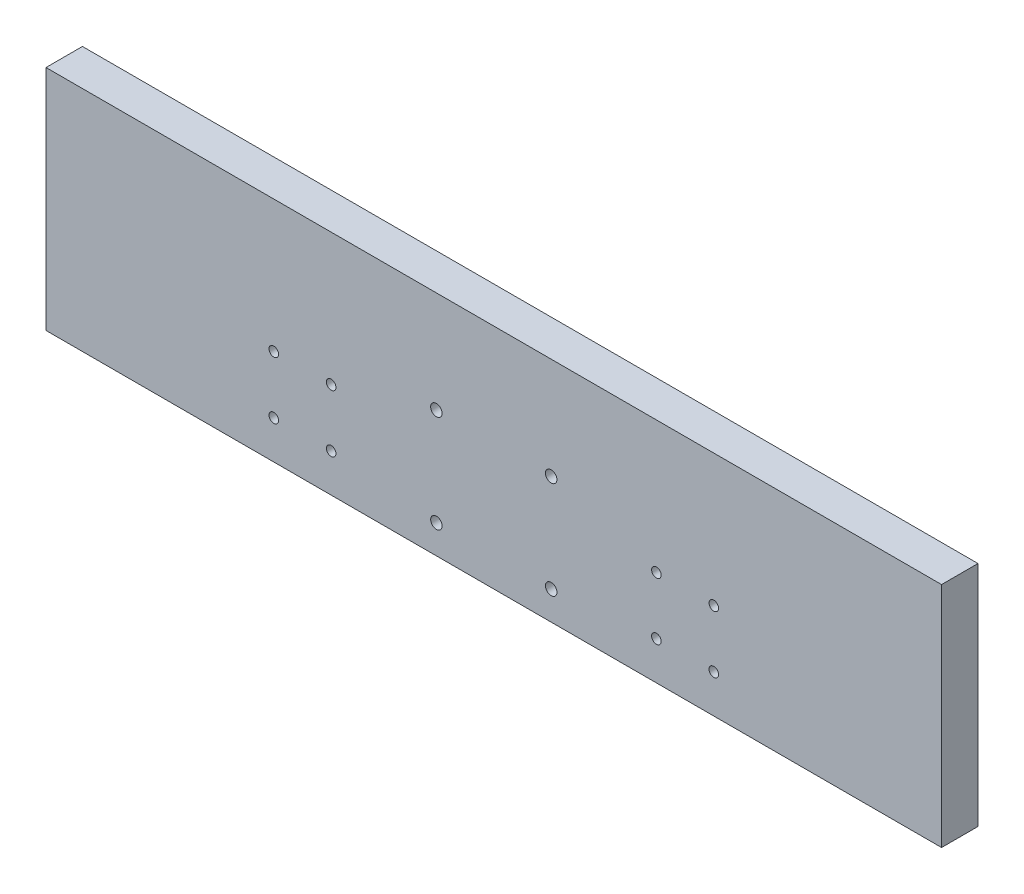
ISO-10303-21;
HEADER;
FILE_DESCRIPTION(('STEP AP214'),'2;1');
FILE_NAME('part.step','',(''),(''),'','','');
FILE_SCHEMA(('AUTOMOTIVE_DESIGN { 1 0 10303 214 1 1 1 1 }'));
ENDSEC;
DATA;
#1=APPLICATION_CONTEXT('core data for automotive mechanical design processes');
#2=APPLICATION_PROTOCOL_DEFINITION('international standard','automotive_design',2000,#1);
#3=PRODUCT_CONTEXT('',#1,'mechanical');
#4=PRODUCT('Part','Part','',(#3));
#5=PRODUCT_RELATED_PRODUCT_CATEGORY('part','',(#4));
#6=PRODUCT_DEFINITION_FORMATION('','',#4);
#7=PRODUCT_DEFINITION_CONTEXT('part definition',#1,'design');
#8=PRODUCT_DEFINITION('design','',#6,#7);
#9=PRODUCT_DEFINITION_SHAPE('','',#8);
#10=(LENGTH_UNIT() NAMED_UNIT(*) SI_UNIT(.MILLI.,.METRE.));
#11=(NAMED_UNIT(*) PLANE_ANGLE_UNIT() SI_UNIT($,.RADIAN.));
#12=(NAMED_UNIT(*) SI_UNIT($,.STERADIAN.) SOLID_ANGLE_UNIT());
#13=UNCERTAINTY_MEASURE_WITH_UNIT(LENGTH_MEASURE(1.E-05),#10,'distance_accuracy_value','');
#14=(GEOMETRIC_REPRESENTATION_CONTEXT(3) GLOBAL_UNCERTAINTY_ASSIGNED_CONTEXT((#13)) GLOBAL_UNIT_ASSIGNED_CONTEXT((#10,
#11,#12)) REPRESENTATION_CONTEXT('',''));
#15=CARTESIAN_POINT('',(0.,0.,0.));
#16=DIRECTION('',(0.,0.,1.));
#17=DIRECTION('',(1.,0.,0.));
#18=AXIS2_PLACEMENT_3D('',#15,#16,#17);
#19=CARTESIAN_POINT('',(234.05,0.,19.05));
#20=DIRECTION('',(-1.,0.,0.));
#21=DIRECTION('',(0.,0.,1.));
#22=AXIS2_PLACEMENT_3D('',#19,#20,#21);
#23=PLANE('',#22);
#24=DIRECTION('',(0.,1.,0.));
#25=VECTOR('',#24,1.);
#26=CARTESIAN_POINT('',(234.05,0.,0.));
#27=LINE('',#26,#25);
#28=CARTESIAN_POINT('',(234.05,0.,0.));
#29=VERTEX_POINT('',#28);
#30=CARTESIAN_POINT('',(234.05,119.05,0.));
#31=VERTEX_POINT('',#30);
#32=EDGE_CURVE('E96',#29,#31,#27,.T.);
#33=ORIENTED_EDGE('',*,*,#32,.T.);
#34=DIRECTION('',(0.,0.,-1.));
#35=VECTOR('',#34,1.);
#36=CARTESIAN_POINT('',(234.05,119.05,19.05));
#37=LINE('',#36,#35);
#38=CARTESIAN_POINT('',(234.05,119.05,19.05));
#39=VERTEX_POINT('',#38);
#40=EDGE_CURVE('E11',#39,#31,#37,.T.);
#41=ORIENTED_EDGE('',*,*,#40,.F.);
#42=DIRECTION('',(0.,1.,0.));
#43=VECTOR('',#42,1.);
#44=CARTESIAN_POINT('',(234.05,0.,19.05));
#45=LINE('',#44,#43);
#46=CARTESIAN_POINT('',(234.05,0.,19.05));
#47=VERTEX_POINT('',#46);
#48=EDGE_CURVE('E84',#47,#39,#45,.T.);
#49=ORIENTED_EDGE('',*,*,#48,.F.);
#50=DIRECTION('',(0.,0.,-1.));
#51=VECTOR('',#50,1.);
#52=CARTESIAN_POINT('',(234.05,0.,19.05));
#53=LINE('',#52,#51);
#54=EDGE_CURVE('E92',#47,#29,#53,.T.);
#55=ORIENTED_EDGE('',*,*,#54,.T.);
#56=EDGE_LOOP('',(#33,#41,#49,#55));
#57=FACE_BOUND('',#56,.T.);
#58=ADVANCED_FACE('F33',(#57),#23,.F.);
#59=CARTESIAN_POINT('',(234.05,119.05,19.05));
#60=DIRECTION('',(0.,-1.,0.));
#61=DIRECTION('',(0.,0.,-1.));
#62=AXIS2_PLACEMENT_3D('',#59,#60,#61);
#63=PLANE('',#62);
#64=DIRECTION('',(-1.,0.,0.));
#65=VECTOR('',#64,1.);
#66=CARTESIAN_POINT('',(234.05,119.05,0.));
#67=LINE('',#66,#65);
#68=CARTESIAN_POINT('',(-234.05,119.05,0.));
#69=VERTEX_POINT('',#68);
#70=EDGE_CURVE('E88',#31,#69,#67,.T.);
#71=ORIENTED_EDGE('',*,*,#70,.T.);
#72=DIRECTION('',(0.,0.,-1.));
#73=VECTOR('',#72,1.);
#74=CARTESIAN_POINT('',(-234.05,119.05,19.05));
#75=LINE('',#74,#73);
#76=CARTESIAN_POINT('',(-234.05,119.05,19.05));
#77=VERTEX_POINT('',#76);
#78=EDGE_CURVE('E41',#77,#69,#75,.T.);
#79=ORIENTED_EDGE('',*,*,#78,.F.);
#80=DIRECTION('',(-1.,0.,0.));
#81=VECTOR('',#80,1.);
#82=CARTESIAN_POINT('',(234.05,119.05,19.05));
#83=LINE('',#82,#81);
#84=EDGE_CURVE('E79',#39,#77,#83,.T.);
#85=ORIENTED_EDGE('',*,*,#84,.F.);
#86=ORIENTED_EDGE('',*,*,#40,.T.);
#87=EDGE_LOOP('',(#71,#79,#85,#86));
#88=FACE_BOUND('',#87,.T.);
#89=ADVANCED_FACE('F87',(#88),#63,.F.);
#90=CARTESIAN_POINT('',(-234.05,0.,19.05));
#91=DIRECTION('',(1.,0.,0.));
#92=DIRECTION('',(0.,0.,-1.));
#93=AXIS2_PLACEMENT_3D('',#90,#91,#92);
#94=PLANE('',#93);
#95=DIRECTION('',(0.,-1.,0.));
#96=VECTOR('',#95,1.);
#97=CARTESIAN_POINT('',(-234.05,0.,0.));
#98=LINE('',#97,#96);
#99=CARTESIAN_POINT('',(-234.05,0.,0.));
#100=VERTEX_POINT('',#99);
#101=EDGE_CURVE('E66',#69,#100,#98,.T.);
#102=ORIENTED_EDGE('',*,*,#101,.T.);
#103=DIRECTION('',(0.,0.,-1.));
#104=VECTOR('',#103,1.);
#105=CARTESIAN_POINT('',(-234.05,0.,19.05));
#106=LINE('',#105,#104);
#107=CARTESIAN_POINT('',(-234.05,0.,19.05));
#108=VERTEX_POINT('',#107);
#109=EDGE_CURVE('E89',#108,#100,#106,.T.);
#110=ORIENTED_EDGE('',*,*,#109,.F.);
#111=DIRECTION('',(0.,-1.,0.));
#112=VECTOR('',#111,1.);
#113=CARTESIAN_POINT('',(-234.05,0.,19.05));
#114=LINE('',#113,#112);
#115=EDGE_CURVE('E82',#77,#108,#114,.T.);
#116=ORIENTED_EDGE('',*,*,#115,.F.);
#117=ORIENTED_EDGE('',*,*,#78,.T.);
#118=EDGE_LOOP('',(#102,#110,#116,#117));
#119=FACE_BOUND('',#118,.T.);
#120=ADVANCED_FACE('F90',(#119),#94,.F.);
#121=CARTESIAN_POINT('',(234.05,0.,19.05));
#122=DIRECTION('',(0.,1.,0.));
#123=DIRECTION('',(0.,0.,1.));
#124=AXIS2_PLACEMENT_3D('',#121,#122,#123);
#125=PLANE('',#124);
#126=DIRECTION('',(1.,0.,0.));
#127=VECTOR('',#126,1.);
#128=CARTESIAN_POINT('',(234.05,0.,0.));
#129=LINE('',#128,#127);
#130=EDGE_CURVE('E72',#100,#29,#129,.T.);
#131=ORIENTED_EDGE('',*,*,#130,.T.);
#132=ORIENTED_EDGE('',*,*,#54,.F.);
#133=DIRECTION('',(1.,0.,0.));
#134=VECTOR('',#133,1.);
#135=CARTESIAN_POINT('',(234.05,0.,19.05));
#136=LINE('',#135,#134);
#137=EDGE_CURVE('E49',#108,#47,#136,.T.);
#138=ORIENTED_EDGE('',*,*,#137,.F.);
#139=ORIENTED_EDGE('',*,*,#109,.T.);
#140=EDGE_LOOP('',(#131,#132,#138,#139));
#141=FACE_BOUND('',#140,.T.);
#142=ADVANCED_FACE('F104',(#141),#125,.F.);
#143=CARTESIAN_POINT('',(0.,0.,19.05));
#144=DIRECTION('',(0.,0.,1.));
#145=DIRECTION('',(1.,0.,0.));
#146=AXIS2_PLACEMENT_3D('',#143,#144,#145);
#147=PLANE('',#146);
#148=CARTESIAN_POINT('',(-30.,15.,19.05));
#149=DIRECTION('',(0.,0.,1.));
#150=DIRECTION('',(1.,0.,0.));
#151=AXIS2_PLACEMENT_3D('',#148,#149,#150);
#152=CIRCLE('',#151,2.99999999999999);
#153=CARTESIAN_POINT('',(-27.,15.,19.05));
#154=VERTEX_POINT('',#153);
#155=EDGE_CURVE('E175',#154,#154,#152,.T.);
#156=ORIENTED_EDGE('',*,*,#155,.F.);
#157=EDGE_LOOP('',(#156));
#158=FACE_BOUND('',#157,.T.);
#159=CARTESIAN_POINT('',(-30.,66.,19.05));
#160=DIRECTION('',(0.,0.,1.));
#161=DIRECTION('',(1.,0.,0.));
#162=AXIS2_PLACEMENT_3D('',#159,#160,#161);
#163=CIRCLE('',#162,2.99999999999999);
#164=CARTESIAN_POINT('',(-27.,66.,19.05));
#165=VERTEX_POINT('',#164);
#166=EDGE_CURVE('E169',#165,#165,#163,.T.);
#167=ORIENTED_EDGE('',*,*,#166,.F.);
#168=EDGE_LOOP('',(#167));
#169=FACE_BOUND('',#168,.T.);
#170=CARTESIAN_POINT('',(30.,15.,19.05));
#171=DIRECTION('',(0.,0.,1.));
#172=DIRECTION('',(1.,0.,0.));
#173=AXIS2_PLACEMENT_3D('',#170,#171,#172);
#174=CIRCLE('',#173,2.99999999999999);
#175=CARTESIAN_POINT('',(33.,15.,19.05));
#176=VERTEX_POINT('',#175);
#177=EDGE_CURVE('E163',#176,#176,#174,.T.);
#178=ORIENTED_EDGE('',*,*,#177,.F.);
#179=EDGE_LOOP('',(#178));
#180=FACE_BOUND('',#179,.T.);
#181=CARTESIAN_POINT('',(30.,66.,19.05));
#182=DIRECTION('',(0.,0.,1.));
#183=DIRECTION('',(1.,0.,0.));
#184=AXIS2_PLACEMENT_3D('',#181,#182,#183);
#185=CIRCLE('',#184,2.99999999999999);
#186=CARTESIAN_POINT('',(33.,66.,19.05));
#187=VERTEX_POINT('',#186);
#188=EDGE_CURVE('E157',#187,#187,#185,.T.);
#189=ORIENTED_EDGE('',*,*,#188,.F.);
#190=EDGE_LOOP('',(#189));
#191=FACE_BOUND('',#190,.T.);
#192=CARTESIAN_POINT('',(115.,20.,19.05));
#193=DIRECTION('',(0.,0.,1.));
#194=DIRECTION('',(1.,0.,0.));
#195=AXIS2_PLACEMENT_3D('',#192,#193,#194);
#196=CIRCLE('',#195,2.5);
#197=CARTESIAN_POINT('',(117.5,20.,19.05));
#198=VERTEX_POINT('',#197);
#199=EDGE_CURVE('E151',#198,#198,#196,.T.);
#200=ORIENTED_EDGE('',*,*,#199,.F.);
#201=EDGE_LOOP('',(#200));
#202=FACE_BOUND('',#201,.T.);
#203=CARTESIAN_POINT('',(115.,50.,19.05));
#204=DIRECTION('',(0.,0.,1.));
#205=DIRECTION('',(1.,0.,0.));
#206=AXIS2_PLACEMENT_3D('',#203,#204,#205);
#207=CIRCLE('',#206,2.5);
#208=CARTESIAN_POINT('',(117.5,50.,19.05));
#209=VERTEX_POINT('',#208);
#210=EDGE_CURVE('E145',#209,#209,#207,.T.);
#211=ORIENTED_EDGE('',*,*,#210,.F.);
#212=EDGE_LOOP('',(#211));
#213=FACE_BOUND('',#212,.T.);
#214=CARTESIAN_POINT('',(85.,50.,19.05));
#215=DIRECTION('',(0.,0.,1.));
#216=DIRECTION('',(1.,0.,0.));
#217=AXIS2_PLACEMENT_3D('',#214,#215,#216);
#218=CIRCLE('',#217,2.5);
#219=CARTESIAN_POINT('',(87.5,50.,19.05));
#220=VERTEX_POINT('',#219);
#221=EDGE_CURVE('E139',#220,#220,#218,.T.);
#222=ORIENTED_EDGE('',*,*,#221,.F.);
#223=EDGE_LOOP('',(#222));
#224=FACE_BOUND('',#223,.T.);
#225=CARTESIAN_POINT('',(85.,20.,19.05));
#226=DIRECTION('',(0.,0.,1.));
#227=DIRECTION('',(1.,0.,0.));
#228=AXIS2_PLACEMENT_3D('',#225,#226,#227);
#229=CIRCLE('',#228,2.5);
#230=CARTESIAN_POINT('',(87.5,20.,19.05));
#231=VERTEX_POINT('',#230);
#232=EDGE_CURVE('E133',#231,#231,#229,.T.);
#233=ORIENTED_EDGE('',*,*,#232,.F.);
#234=EDGE_LOOP('',(#233));
#235=FACE_BOUND('',#234,.T.);
#236=CARTESIAN_POINT('',(-85.,20.,19.05));
#237=DIRECTION('',(0.,0.,1.));
#238=DIRECTION('',(1.,0.,0.));
#239=AXIS2_PLACEMENT_3D('',#236,#237,#238);
#240=CIRCLE('',#239,2.5);
#241=CARTESIAN_POINT('',(-82.5,20.,19.05));
#242=VERTEX_POINT('',#241);
#243=EDGE_CURVE('E127',#242,#242,#240,.T.);
#244=ORIENTED_EDGE('',*,*,#243,.F.);
#245=EDGE_LOOP('',(#244));
#246=FACE_BOUND('',#245,.T.);
#247=CARTESIAN_POINT('',(-85.,50.,19.05));
#248=DIRECTION('',(0.,0.,1.));
#249=DIRECTION('',(1.,0.,0.));
#250=AXIS2_PLACEMENT_3D('',#247,#248,#249);
#251=CIRCLE('',#250,2.5);
#252=CARTESIAN_POINT('',(-82.5,50.,19.05));
#253=VERTEX_POINT('',#252);
#254=EDGE_CURVE('E121',#253,#253,#251,.T.);
#255=ORIENTED_EDGE('',*,*,#254,.F.);
#256=EDGE_LOOP('',(#255));
#257=FACE_BOUND('',#256,.T.);
#258=CARTESIAN_POINT('',(-115.,50.,19.05));
#259=DIRECTION('',(0.,0.,1.));
#260=DIRECTION('',(1.,0.,0.));
#261=AXIS2_PLACEMENT_3D('',#258,#259,#260);
#262=CIRCLE('',#261,2.5);
#263=CARTESIAN_POINT('',(-112.5,50.,19.05));
#264=VERTEX_POINT('',#263);
#265=EDGE_CURVE('E115',#264,#264,#262,.T.);
#266=ORIENTED_EDGE('',*,*,#265,.F.);
#267=EDGE_LOOP('',(#266));
#268=FACE_BOUND('',#267,.T.);
#269=CARTESIAN_POINT('',(-115.,20.,19.05));
#270=DIRECTION('',(0.,0.,1.));
#271=DIRECTION('',(1.,0.,0.));
#272=AXIS2_PLACEMENT_3D('',#269,#270,#271);
#273=CIRCLE('',#272,2.5);
#274=CARTESIAN_POINT('',(-112.5,20.,19.05));
#275=VERTEX_POINT('',#274);
#276=EDGE_CURVE('E99',#275,#275,#273,.T.);
#277=ORIENTED_EDGE('',*,*,#276,.F.);
#278=EDGE_LOOP('',(#277));
#279=FACE_BOUND('',#278,.T.);
#280=ORIENTED_EDGE('',*,*,#48,.T.);
#281=ORIENTED_EDGE('',*,*,#84,.T.);
#282=ORIENTED_EDGE('',*,*,#115,.T.);
#283=ORIENTED_EDGE('',*,*,#137,.T.);
#284=EDGE_LOOP('',(#280,#281,#282,#283));
#285=FACE_BOUND('',#284,.T.);
#286=ADVANCED_FACE('F80',(#158,#169,#180,#191,#202,#213,#224,#235,#246,#257,#268,#279,#285),
#147,.T.);
#287=CARTESIAN_POINT('',(0.,0.,0.));
#288=DIRECTION('',(0.,0.,1.));
#289=DIRECTION('',(1.,0.,0.));
#290=AXIS2_PLACEMENT_3D('',#287,#288,#289);
#291=PLANE('',#290);
#292=CARTESIAN_POINT('',(-30.,15.,0.));
#293=DIRECTION('',(0.,0.,-1.));
#294=DIRECTION('',(-1.,0.,0.));
#295=AXIS2_PLACEMENT_3D('',#292,#293,#294);
#296=CIRCLE('',#295,2.99999999999999);
#297=CARTESIAN_POINT('',(-33.,15.,0.));
#298=VERTEX_POINT('',#297);
#299=EDGE_CURVE('E178',#298,#298,#296,.T.);
#300=ORIENTED_EDGE('',*,*,#299,.F.);
#301=EDGE_LOOP('',(#300));
#302=FACE_BOUND('',#301,.T.);
#303=CARTESIAN_POINT('',(-30.,66.,0.));
#304=DIRECTION('',(0.,0.,-1.));
#305=DIRECTION('',(-1.,0.,0.));
#306=AXIS2_PLACEMENT_3D('',#303,#304,#305);
#307=CIRCLE('',#306,2.99999999999999);
#308=CARTESIAN_POINT('',(-33.,66.,0.));
#309=VERTEX_POINT('',#308);
#310=EDGE_CURVE('E172',#309,#309,#307,.T.);
#311=ORIENTED_EDGE('',*,*,#310,.F.);
#312=EDGE_LOOP('',(#311));
#313=FACE_BOUND('',#312,.T.);
#314=CARTESIAN_POINT('',(30.,15.,0.));
#315=DIRECTION('',(0.,0.,-1.));
#316=DIRECTION('',(-1.,0.,0.));
#317=AXIS2_PLACEMENT_3D('',#314,#315,#316);
#318=CIRCLE('',#317,2.99999999999999);
#319=CARTESIAN_POINT('',(27.,15.,0.));
#320=VERTEX_POINT('',#319);
#321=EDGE_CURVE('E166',#320,#320,#318,.T.);
#322=ORIENTED_EDGE('',*,*,#321,.F.);
#323=EDGE_LOOP('',(#322));
#324=FACE_BOUND('',#323,.T.);
#325=CARTESIAN_POINT('',(30.,66.,0.));
#326=DIRECTION('',(0.,0.,-1.));
#327=DIRECTION('',(-1.,0.,0.));
#328=AXIS2_PLACEMENT_3D('',#325,#326,#327);
#329=CIRCLE('',#328,2.99999999999999);
#330=CARTESIAN_POINT('',(27.,66.,0.));
#331=VERTEX_POINT('',#330);
#332=EDGE_CURVE('E160',#331,#331,#329,.T.);
#333=ORIENTED_EDGE('',*,*,#332,.F.);
#334=EDGE_LOOP('',(#333));
#335=FACE_BOUND('',#334,.T.);
#336=CARTESIAN_POINT('',(115.,20.,0.));
#337=DIRECTION('',(0.,0.,-1.));
#338=DIRECTION('',(-1.,0.,0.));
#339=AXIS2_PLACEMENT_3D('',#336,#337,#338);
#340=CIRCLE('',#339,2.5);
#341=CARTESIAN_POINT('',(112.5,20.,0.));
#342=VERTEX_POINT('',#341);
#343=EDGE_CURVE('E154',#342,#342,#340,.T.);
#344=ORIENTED_EDGE('',*,*,#343,.F.);
#345=EDGE_LOOP('',(#344));
#346=FACE_BOUND('',#345,.T.);
#347=CARTESIAN_POINT('',(115.,50.,0.));
#348=DIRECTION('',(0.,0.,-1.));
#349=DIRECTION('',(-1.,0.,0.));
#350=AXIS2_PLACEMENT_3D('',#347,#348,#349);
#351=CIRCLE('',#350,2.5);
#352=CARTESIAN_POINT('',(112.5,50.,0.));
#353=VERTEX_POINT('',#352);
#354=EDGE_CURVE('E148',#353,#353,#351,.T.);
#355=ORIENTED_EDGE('',*,*,#354,.F.);
#356=EDGE_LOOP('',(#355));
#357=FACE_BOUND('',#356,.T.);
#358=CARTESIAN_POINT('',(85.,50.,0.));
#359=DIRECTION('',(0.,0.,-1.));
#360=DIRECTION('',(-1.,0.,0.));
#361=AXIS2_PLACEMENT_3D('',#358,#359,#360);
#362=CIRCLE('',#361,2.5);
#363=CARTESIAN_POINT('',(82.5,50.,0.));
#364=VERTEX_POINT('',#363);
#365=EDGE_CURVE('E142',#364,#364,#362,.T.);
#366=ORIENTED_EDGE('',*,*,#365,.F.);
#367=EDGE_LOOP('',(#366));
#368=FACE_BOUND('',#367,.T.);
#369=CARTESIAN_POINT('',(85.,20.,0.));
#370=DIRECTION('',(0.,0.,-1.));
#371=DIRECTION('',(-1.,0.,0.));
#372=AXIS2_PLACEMENT_3D('',#369,#370,#371);
#373=CIRCLE('',#372,2.5);
#374=CARTESIAN_POINT('',(82.5,20.,0.));
#375=VERTEX_POINT('',#374);
#376=EDGE_CURVE('E136',#375,#375,#373,.T.);
#377=ORIENTED_EDGE('',*,*,#376,.F.);
#378=EDGE_LOOP('',(#377));
#379=FACE_BOUND('',#378,.T.);
#380=CARTESIAN_POINT('',(-85.,20.,0.));
#381=DIRECTION('',(0.,0.,-1.));
#382=DIRECTION('',(-1.,0.,0.));
#383=AXIS2_PLACEMENT_3D('',#380,#381,#382);
#384=CIRCLE('',#383,2.5);
#385=CARTESIAN_POINT('',(-87.5,20.,0.));
#386=VERTEX_POINT('',#385);
#387=EDGE_CURVE('E130',#386,#386,#384,.T.);
#388=ORIENTED_EDGE('',*,*,#387,.F.);
#389=EDGE_LOOP('',(#388));
#390=FACE_BOUND('',#389,.T.);
#391=CARTESIAN_POINT('',(-85.,50.,0.));
#392=DIRECTION('',(0.,0.,-1.));
#393=DIRECTION('',(-1.,0.,0.));
#394=AXIS2_PLACEMENT_3D('',#391,#392,#393);
#395=CIRCLE('',#394,2.5);
#396=CARTESIAN_POINT('',(-87.5,50.,0.));
#397=VERTEX_POINT('',#396);
#398=EDGE_CURVE('E124',#397,#397,#395,.T.);
#399=ORIENTED_EDGE('',*,*,#398,.F.);
#400=EDGE_LOOP('',(#399));
#401=FACE_BOUND('',#400,.T.);
#402=CARTESIAN_POINT('',(-115.,50.,0.));
#403=DIRECTION('',(0.,0.,-1.));
#404=DIRECTION('',(-1.,0.,0.));
#405=AXIS2_PLACEMENT_3D('',#402,#403,#404);
#406=CIRCLE('',#405,2.5);
#407=CARTESIAN_POINT('',(-117.5,50.,0.));
#408=VERTEX_POINT('',#407);
#409=EDGE_CURVE('E118',#408,#408,#406,.T.);
#410=ORIENTED_EDGE('',*,*,#409,.F.);
#411=EDGE_LOOP('',(#410));
#412=FACE_BOUND('',#411,.T.);
#413=CARTESIAN_POINT('',(-115.,20.,0.));
#414=DIRECTION('',(0.,0.,-1.));
#415=DIRECTION('',(-1.,0.,0.));
#416=AXIS2_PLACEMENT_3D('',#413,#414,#415);
#417=CIRCLE('',#416,2.5);
#418=CARTESIAN_POINT('',(-117.5,20.,0.));
#419=VERTEX_POINT('',#418);
#420=EDGE_CURVE('E112',#419,#419,#417,.T.);
#421=ORIENTED_EDGE('',*,*,#420,.F.);
#422=EDGE_LOOP('',(#421));
#423=FACE_BOUND('',#422,.T.);
#424=ORIENTED_EDGE('',*,*,#32,.F.);
#425=ORIENTED_EDGE('',*,*,#130,.F.);
#426=ORIENTED_EDGE('',*,*,#101,.F.);
#427=ORIENTED_EDGE('',*,*,#70,.F.);
#428=EDGE_LOOP('',(#424,#425,#426,#427));
#429=FACE_BOUND('',#428,.T.);
#430=ADVANCED_FACE('F107',(#302,#313,#324,#335,#346,#357,#368,#379,#390,#401,#412,#423,#429),
#291,.F.);
#431=CARTESIAN_POINT('',(-115.,20.,0.));
#432=DIRECTION('',(0.,0.,-1.));
#433=DIRECTION('',(-1.,0.,0.));
#434=AXIS2_PLACEMENT_3D('',#431,#432,#433);
#435=CYLINDRICAL_SURFACE('',#434,2.5);
#436=ORIENTED_EDGE('',*,*,#276,.T.);
#437=EDGE_LOOP('',(#436));
#438=FACE_BOUND('',#437,.T.);
#439=ORIENTED_EDGE('',*,*,#420,.T.);
#440=EDGE_LOOP('',(#439));
#441=FACE_BOUND('',#440,.T.);
#442=ADVANCED_FACE('F186',(#438,#441),#435,.F.);
#443=CARTESIAN_POINT('',(-115.,50.,0.));
#444=DIRECTION('',(0.,0.,-1.));
#445=DIRECTION('',(-1.,0.,0.));
#446=AXIS2_PLACEMENT_3D('',#443,#444,#445);
#447=CYLINDRICAL_SURFACE('',#446,2.5);
#448=ORIENTED_EDGE('',*,*,#265,.T.);
#449=EDGE_LOOP('',(#448));
#450=FACE_BOUND('',#449,.T.);
#451=ORIENTED_EDGE('',*,*,#409,.T.);
#452=EDGE_LOOP('',(#451));
#453=FACE_BOUND('',#452,.T.);
#454=ADVANCED_FACE('F211',(#450,#453),#447,.F.);
#455=CARTESIAN_POINT('',(-85.,50.,0.));
#456=DIRECTION('',(0.,0.,-1.));
#457=DIRECTION('',(-1.,0.,0.));
#458=AXIS2_PLACEMENT_3D('',#455,#456,#457);
#459=CYLINDRICAL_SURFACE('',#458,2.5);
#460=ORIENTED_EDGE('',*,*,#254,.T.);
#461=EDGE_LOOP('',(#460));
#462=FACE_BOUND('',#461,.T.);
#463=ORIENTED_EDGE('',*,*,#398,.T.);
#464=EDGE_LOOP('',(#463));
#465=FACE_BOUND('',#464,.T.);
#466=ADVANCED_FACE('F217',(#462,#465),#459,.F.);
#467=CARTESIAN_POINT('',(-85.,20.,0.));
#468=DIRECTION('',(0.,0.,-1.));
#469=DIRECTION('',(-1.,0.,0.));
#470=AXIS2_PLACEMENT_3D('',#467,#468,#469);
#471=CYLINDRICAL_SURFACE('',#470,2.5);
#472=ORIENTED_EDGE('',*,*,#243,.T.);
#473=EDGE_LOOP('',(#472));
#474=FACE_BOUND('',#473,.T.);
#475=ORIENTED_EDGE('',*,*,#387,.T.);
#476=EDGE_LOOP('',(#475));
#477=FACE_BOUND('',#476,.T.);
#478=ADVANCED_FACE('F262',(#474,#477),#471,.F.);
#479=CARTESIAN_POINT('',(85.,20.,0.));
#480=DIRECTION('',(0.,0.,-1.));
#481=DIRECTION('',(-1.,0.,0.));
#482=AXIS2_PLACEMENT_3D('',#479,#480,#481);
#483=CYLINDRICAL_SURFACE('',#482,2.5);
#484=ORIENTED_EDGE('',*,*,#232,.T.);
#485=EDGE_LOOP('',(#484));
#486=FACE_BOUND('',#485,.T.);
#487=ORIENTED_EDGE('',*,*,#376,.T.);
#488=EDGE_LOOP('',(#487));
#489=FACE_BOUND('',#488,.T.);
#490=ADVANCED_FACE('F267',(#486,#489),#483,.F.);
#491=CARTESIAN_POINT('',(85.,50.,0.));
#492=DIRECTION('',(0.,0.,-1.));
#493=DIRECTION('',(-1.,0.,0.));
#494=AXIS2_PLACEMENT_3D('',#491,#492,#493);
#495=CYLINDRICAL_SURFACE('',#494,2.5);
#496=ORIENTED_EDGE('',*,*,#221,.T.);
#497=EDGE_LOOP('',(#496));
#498=FACE_BOUND('',#497,.T.);
#499=ORIENTED_EDGE('',*,*,#365,.T.);
#500=EDGE_LOOP('',(#499));
#501=FACE_BOUND('',#500,.T.);
#502=ADVANCED_FACE('F273',(#498,#501),#495,.F.);
#503=CARTESIAN_POINT('',(115.,50.,0.));
#504=DIRECTION('',(0.,0.,-1.));
#505=DIRECTION('',(-1.,0.,0.));
#506=AXIS2_PLACEMENT_3D('',#503,#504,#505);
#507=CYLINDRICAL_SURFACE('',#506,2.5);
#508=ORIENTED_EDGE('',*,*,#210,.T.);
#509=EDGE_LOOP('',(#508));
#510=FACE_BOUND('',#509,.T.);
#511=ORIENTED_EDGE('',*,*,#354,.T.);
#512=EDGE_LOOP('',(#511));
#513=FACE_BOUND('',#512,.T.);
#514=ADVANCED_FACE('F277',(#510,#513),#507,.F.);
#515=CARTESIAN_POINT('',(115.,20.,0.));
#516=DIRECTION('',(0.,0.,-1.));
#517=DIRECTION('',(-1.,0.,0.));
#518=AXIS2_PLACEMENT_3D('',#515,#516,#517);
#519=CYLINDRICAL_SURFACE('',#518,2.5);
#520=ORIENTED_EDGE('',*,*,#199,.T.);
#521=EDGE_LOOP('',(#520));
#522=FACE_BOUND('',#521,.T.);
#523=ORIENTED_EDGE('',*,*,#343,.T.);
#524=EDGE_LOOP('',(#523));
#525=FACE_BOUND('',#524,.T.);
#526=ADVANCED_FACE('F281',(#522,#525),#519,.F.);
#527=CARTESIAN_POINT('',(30.,66.,0.));
#528=DIRECTION('',(0.,0.,-1.));
#529=DIRECTION('',(-1.,0.,0.));
#530=AXIS2_PLACEMENT_3D('',#527,#528,#529);
#531=CYLINDRICAL_SURFACE('',#530,2.99999999999999);
#532=ORIENTED_EDGE('',*,*,#188,.T.);
#533=EDGE_LOOP('',(#532));
#534=FACE_BOUND('',#533,.T.);
#535=ORIENTED_EDGE('',*,*,#332,.T.);
#536=EDGE_LOOP('',(#535));
#537=FACE_BOUND('',#536,.T.);
#538=ADVANCED_FACE('F285',(#534,#537),#531,.F.);
#539=CARTESIAN_POINT('',(30.,15.,0.));
#540=DIRECTION('',(0.,0.,-1.));
#541=DIRECTION('',(-1.,0.,0.));
#542=AXIS2_PLACEMENT_3D('',#539,#540,#541);
#543=CYLINDRICAL_SURFACE('',#542,2.99999999999999);
#544=ORIENTED_EDGE('',*,*,#177,.T.);
#545=EDGE_LOOP('',(#544));
#546=FACE_BOUND('',#545,.T.);
#547=ORIENTED_EDGE('',*,*,#321,.T.);
#548=EDGE_LOOP('',(#547));
#549=FACE_BOUND('',#548,.T.);
#550=ADVANCED_FACE('F289',(#546,#549),#543,.F.);
#551=CARTESIAN_POINT('',(-30.,66.,0.));
#552=DIRECTION('',(0.,0.,-1.));
#553=DIRECTION('',(-1.,0.,0.));
#554=AXIS2_PLACEMENT_3D('',#551,#552,#553);
#555=CYLINDRICAL_SURFACE('',#554,2.99999999999999);
#556=ORIENTED_EDGE('',*,*,#166,.T.);
#557=EDGE_LOOP('',(#556));
#558=FACE_BOUND('',#557,.T.);
#559=ORIENTED_EDGE('',*,*,#310,.T.);
#560=EDGE_LOOP('',(#559));
#561=FACE_BOUND('',#560,.T.);
#562=ADVANCED_FACE('F293',(#558,#561),#555,.F.);
#563=CARTESIAN_POINT('',(-30.,15.,0.));
#564=DIRECTION('',(0.,0.,-1.));
#565=DIRECTION('',(-1.,0.,0.));
#566=AXIS2_PLACEMENT_3D('',#563,#564,#565);
#567=CYLINDRICAL_SURFACE('',#566,2.99999999999999);
#568=ORIENTED_EDGE('',*,*,#155,.T.);
#569=EDGE_LOOP('',(#568));
#570=FACE_BOUND('',#569,.T.);
#571=ORIENTED_EDGE('',*,*,#299,.T.);
#572=EDGE_LOOP('',(#571));
#573=FACE_BOUND('',#572,.T.);
#574=ADVANCED_FACE('F182',(#570,#573),#567,.F.);
#575=CLOSED_SHELL('',(#58,#89,#120,#142,#286,#430,#442,#454,#466,#478,#490,#502,#514,#526,#538,
#550,#562,#574));
#576=MANIFOLD_SOLID_BREP('B2',#575);
#577=ADVANCED_BREP_SHAPE_REPRESENTATION('',(#18,#576),#14);
#578=SHAPE_DEFINITION_REPRESENTATION(#9,#577);
ENDSEC;
END-ISO-10303-21;
